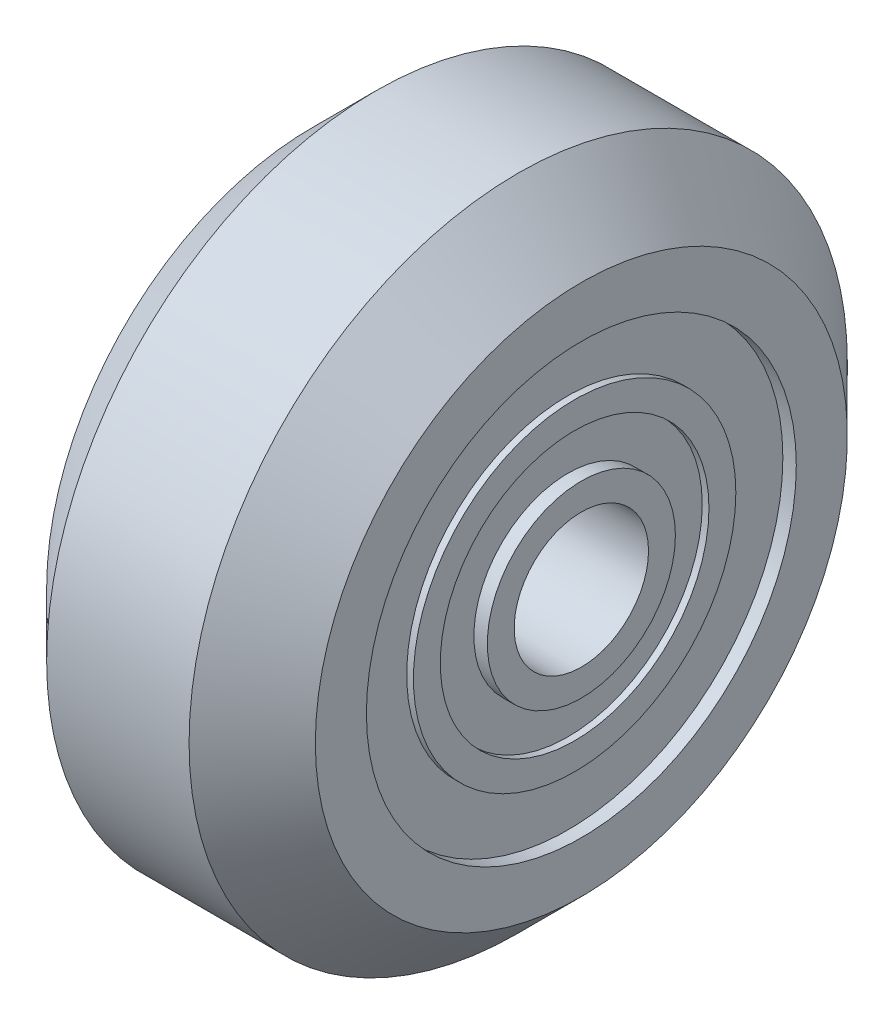
ISO-10303-21;
HEADER;
FILE_DESCRIPTION(('STEP AP214'),'2;1');
FILE_NAME('part.step','',(''),(''),'','','');
FILE_SCHEMA(('AUTOMOTIVE_DESIGN { 1 0 10303 214 1 1 1 1 }'));
ENDSEC;
DATA;
#1=APPLICATION_CONTEXT('core data for automotive mechanical design processes');
#2=APPLICATION_PROTOCOL_DEFINITION('international standard','automotive_design',2000,#1);
#3=PRODUCT_CONTEXT('',#1,'mechanical');
#4=PRODUCT('Part','Part','',(#3));
#5=PRODUCT_RELATED_PRODUCT_CATEGORY('part','',(#4));
#6=PRODUCT_DEFINITION_FORMATION('','',#4);
#7=PRODUCT_DEFINITION_CONTEXT('part definition',#1,'design');
#8=PRODUCT_DEFINITION('design','',#6,#7);
#9=PRODUCT_DEFINITION_SHAPE('','',#8);
#10=(LENGTH_UNIT() NAMED_UNIT(*) SI_UNIT(.MILLI.,.METRE.));
#11=(NAMED_UNIT(*) PLANE_ANGLE_UNIT() SI_UNIT($,.RADIAN.));
#12=(NAMED_UNIT(*) SI_UNIT($,.STERADIAN.) SOLID_ANGLE_UNIT());
#13=UNCERTAINTY_MEASURE_WITH_UNIT(LENGTH_MEASURE(1.E-05),#10,'distance_accuracy_value','');
#14=(GEOMETRIC_REPRESENTATION_CONTEXT(3) GLOBAL_UNCERTAINTY_ASSIGNED_CONTEXT((#13)) GLOBAL_UNIT_ASSIGNED_CONTEXT((#10,
#11,#12)) REPRESENTATION_CONTEXT('',''));
#15=CARTESIAN_POINT('',(0.,0.,0.));
#16=DIRECTION('',(0.,0.,1.));
#17=DIRECTION('',(1.,0.,0.));
#18=AXIS2_PLACEMENT_3D('',#15,#16,#17);
#19=CARTESIAN_POINT('',(4.75,0.,0.));
#20=DIRECTION('',(-1.,0.,0.));
#21=DIRECTION('',(0.,0.,1.));
#22=AXIS2_PLACEMENT_3D('',#19,#20,#21);
#23=CYLINDRICAL_SURFACE('',#22,5.);
#24=CARTESIAN_POINT('',(-4.75,0.,0.));
#25=DIRECTION('',(1.,0.,0.));
#26=DIRECTION('',(0.,0.,-1.));
#27=AXIS2_PLACEMENT_3D('',#24,#25,#26);
#28=CIRCLE('',#27,5.);
#29=CARTESIAN_POINT('',(-4.75,0.,-5.));
#30=VERTEX_POINT('',#29);
#31=EDGE_CURVE('E101',#30,#30,#28,.T.);
#32=ORIENTED_EDGE('',*,*,#31,.F.);
#33=EDGE_LOOP('',(#32));
#34=FACE_BOUND('',#33,.T.);
#35=CARTESIAN_POINT('',(-4.5,0.,0.));
#36=DIRECTION('',(1.,0.,0.));
#37=DIRECTION('',(0.,0.,-1.));
#38=AXIS2_PLACEMENT_3D('',#35,#36,#37);
#39=CIRCLE('',#38,5.);
#40=CARTESIAN_POINT('',(-4.5,0.,-5.));
#41=VERTEX_POINT('',#40);
#42=EDGE_CURVE('E112',#41,#41,#39,.T.);
#43=ORIENTED_EDGE('',*,*,#42,.T.);
#44=EDGE_LOOP('',(#43));
#45=FACE_BOUND('',#44,.T.);
#46=ADVANCED_FACE('F43',(#34,#45),#23,.F.);
#47=CARTESIAN_POINT('',(-45.5860465116277,0.,0.));
#48=DIRECTION('',(-1.,0.,0.));
#49=DIRECTION('',(0.,0.,1.));
#50=AXIS2_PLACEMENT_3D('',#47,#48,#49);
#51=CYLINDRICAL_SURFACE('',#50,8.);
#52=CARTESIAN_POINT('',(-5.,0.,0.));
#53=DIRECTION('',(-1.,0.,0.));
#54=DIRECTION('',(0.,0.,1.));
#55=AXIS2_PLACEMENT_3D('',#52,#53,#54);
#56=CIRCLE('',#55,8.);
#57=CARTESIAN_POINT('',(-5.,0.,8.));
#58=VERTEX_POINT('',#57);
#59=EDGE_CURVE('E79',#58,#58,#56,.T.);
#60=ORIENTED_EDGE('',*,*,#59,.T.);
#61=EDGE_LOOP('',(#60));
#62=FACE_BOUND('',#61,.T.);
#63=CARTESIAN_POINT('',(-4.5,0.,0.));
#64=DIRECTION('',(1.,0.,0.));
#65=DIRECTION('',(0.,0.,-1.));
#66=AXIS2_PLACEMENT_3D('',#63,#64,#65);
#67=CIRCLE('',#66,8.);
#68=CARTESIAN_POINT('',(-4.5,0.,-8.));
#69=VERTEX_POINT('',#68);
#70=EDGE_CURVE('E51',#69,#69,#67,.F.);
#71=ORIENTED_EDGE('',*,*,#70,.F.);
#72=EDGE_LOOP('',(#71));
#73=FACE_BOUND('',#72,.T.);
#74=ADVANCED_FACE('F164',(#62,#73),#51,.F.);
#75=CARTESIAN_POINT('',(4.5,0.,0.));
#76=DIRECTION('',(1.,0.,0.));
#77=DIRECTION('',(0.,0.,-1.));
#78=AXIS2_PLACEMENT_3D('',#75,#76,#77);
#79=CIRCLE('',#78,8.);
#80=CARTESIAN_POINT('',(4.5,0.,-8.));
#81=VERTEX_POINT('',#80);
#82=EDGE_CURVE('E83',#81,#81,#79,.T.);
#83=ORIENTED_EDGE('',*,*,#82,.F.);
#84=EDGE_LOOP('',(#83));
#85=FACE_BOUND('',#84,.T.);
#86=CARTESIAN_POINT('',(5.,0.,0.));
#87=DIRECTION('',(-1.,0.,0.));
#88=DIRECTION('',(0.,0.,1.));
#89=AXIS2_PLACEMENT_3D('',#86,#87,#88);
#90=CIRCLE('',#89,8.);
#91=CARTESIAN_POINT('',(5.,0.,8.));
#92=VERTEX_POINT('',#91);
#93=EDGE_CURVE('E56',#92,#92,#90,.T.);
#94=ORIENTED_EDGE('',*,*,#93,.F.);
#95=EDGE_LOOP('',(#94));
#96=FACE_BOUND('',#95,.T.);
#97=ADVANCED_FACE('F45',(#85,#96),#51,.F.);
#98=CARTESIAN_POINT('',(5.,8.,0.));
#99=DIRECTION('',(-1.,0.,0.));
#100=DIRECTION('',(0.,0.,1.));
#101=AXIS2_PLACEMENT_3D('',#98,#99,#100);
#102=PLANE('',#101);
#103=CARTESIAN_POINT('',(5.,0.,0.));
#104=DIRECTION('',(-1.,0.,0.));
#105=DIRECTION('',(0.,0.,1.));
#106=AXIS2_PLACEMENT_3D('',#103,#104,#105);
#107=CIRCLE('',#106,9.9);
#108=CARTESIAN_POINT('',(5.,0.,9.9));
#109=VERTEX_POINT('',#108);
#110=EDGE_CURVE('E61',#109,#109,#107,.T.);
#111=ORIENTED_EDGE('',*,*,#110,.F.);
#112=EDGE_LOOP('',(#111));
#113=FACE_BOUND('',#112,.T.);
#114=ORIENTED_EDGE('',*,*,#93,.T.);
#115=EDGE_LOOP('',(#114));
#116=FACE_BOUND('',#115,.T.);
#117=ADVANCED_FACE('F354',(#113,#116),#102,.F.);
#118=CARTESIAN_POINT('',(5.,0.,0.));
#119=DIRECTION('',(-1.,0.,0.));
#120=DIRECTION('',(0.,0.,1.));
#121=AXIS2_PLACEMENT_3D('',#118,#119,#120);
#122=CONICAL_SURFACE('',#121,9.9,0.785398163397447);
#123=CARTESIAN_POINT('',(2.65,0.,0.));
#124=DIRECTION('',(-1.,0.,0.));
#125=DIRECTION('',(0.,0.,1.));
#126=AXIS2_PLACEMENT_3D('',#123,#124,#125);
#127=CIRCLE('',#126,12.25);
#128=CARTESIAN_POINT('',(2.65,0.,12.25));
#129=VERTEX_POINT('',#128);
#130=EDGE_CURVE('E67',#129,#129,#127,.T.);
#131=ORIENTED_EDGE('',*,*,#130,.F.);
#132=EDGE_LOOP('',(#131));
#133=FACE_BOUND('',#132,.T.);
#134=ORIENTED_EDGE('',*,*,#110,.T.);
#135=EDGE_LOOP('',(#134));
#136=FACE_BOUND('',#135,.T.);
#137=ADVANCED_FACE('F345',(#133,#136),#122,.T.);
#138=CARTESIAN_POINT('',(-45.5860465116277,0.,0.));
#139=DIRECTION('',(-1.,0.,0.));
#140=DIRECTION('',(0.,0.,1.));
#141=AXIS2_PLACEMENT_3D('',#138,#139,#140);
#142=CYLINDRICAL_SURFACE('',#141,12.25);
#143=CARTESIAN_POINT('',(-2.64999999999999,0.,0.));
#144=DIRECTION('',(-1.,0.,0.));
#145=DIRECTION('',(0.,0.,1.));
#146=AXIS2_PLACEMENT_3D('',#143,#144,#145);
#147=CIRCLE('',#146,12.25);
#148=CARTESIAN_POINT('',(-2.64999999999999,0.,12.25));
#149=VERTEX_POINT('',#148);
#150=EDGE_CURVE('E71',#149,#149,#147,.T.);
#151=ORIENTED_EDGE('',*,*,#150,.F.);
#152=EDGE_LOOP('',(#151));
#153=FACE_BOUND('',#152,.T.);
#154=ORIENTED_EDGE('',*,*,#130,.T.);
#155=EDGE_LOOP('',(#154));
#156=FACE_BOUND('',#155,.T.);
#157=ADVANCED_FACE('F336',(#153,#156),#142,.T.);
#158=CARTESIAN_POINT('',(-2.64999999999999,0.,0.));
#159=DIRECTION('',(1.,0.,0.));
#160=DIRECTION('',(0.,0.,-1.));
#161=AXIS2_PLACEMENT_3D('',#158,#159,#160);
#162=CONICAL_SURFACE('',#161,12.25,0.785398163397449);
#163=CARTESIAN_POINT('',(-4.99999999999999,0.,0.));
#164=DIRECTION('',(-1.,0.,0.));
#165=DIRECTION('',(0.,0.,1.));
#166=AXIS2_PLACEMENT_3D('',#163,#164,#165);
#167=CIRCLE('',#166,9.9);
#168=CARTESIAN_POINT('',(-4.99999999999999,0.,9.9));
#169=VERTEX_POINT('',#168);
#170=EDGE_CURVE('E75',#169,#169,#167,.T.);
#171=ORIENTED_EDGE('',*,*,#170,.F.);
#172=EDGE_LOOP('',(#171));
#173=FACE_BOUND('',#172,.T.);
#174=ORIENTED_EDGE('',*,*,#150,.T.);
#175=EDGE_LOOP('',(#174));
#176=FACE_BOUND('',#175,.T.);
#177=ADVANCED_FACE('F327',(#173,#176),#162,.T.);
#178=CARTESIAN_POINT('',(-4.99999999999999,8.,0.));
#179=DIRECTION('',(1.,0.,0.));
#180=DIRECTION('',(0.,0.,-1.));
#181=AXIS2_PLACEMENT_3D('',#178,#179,#180);
#182=PLANE('',#181);
#183=ORIENTED_EDGE('',*,*,#59,.F.);
#184=EDGE_LOOP('',(#183));
#185=FACE_BOUND('',#184,.T.);
#186=ORIENTED_EDGE('',*,*,#170,.T.);
#187=EDGE_LOOP('',(#186));
#188=FACE_BOUND('',#187,.T.);
#189=ADVANCED_FACE('F312',(#185,#188),#182,.F.);
#190=CARTESIAN_POINT('',(4.5,0.,0.));
#191=DIRECTION('',(1.,0.,0.));
#192=DIRECTION('',(0.,0.,-1.));
#193=AXIS2_PLACEMENT_3D('',#190,#191,#192);
#194=PLANE('',#193);
#195=CARTESIAN_POINT('',(4.5,0.,0.));
#196=DIRECTION('',(1.,0.,0.));
#197=DIRECTION('',(0.,0.,-1.));
#198=AXIS2_PLACEMENT_3D('',#195,#196,#197);
#199=CIRCLE('',#198,6.);
#200=CARTESIAN_POINT('',(4.5,0.,-6.));
#201=VERTEX_POINT('',#200);
#202=EDGE_CURVE('E87',#201,#201,#199,.T.);
#203=ORIENTED_EDGE('',*,*,#202,.F.);
#204=EDGE_LOOP('',(#203));
#205=FACE_BOUND('',#204,.T.);
#206=ORIENTED_EDGE('',*,*,#82,.T.);
#207=EDGE_LOOP('',(#206));
#208=FACE_BOUND('',#207,.T.);
#209=ADVANCED_FACE('F302',(#205,#208),#194,.T.);
#210=CARTESIAN_POINT('',(-4.5,0.,0.));
#211=DIRECTION('',(1.,0.,0.));
#212=DIRECTION('',(0.,0.,-1.));
#213=AXIS2_PLACEMENT_3D('',#210,#211,#212);
#214=PLANE('',#213);
#215=CARTESIAN_POINT('',(-4.5,0.,0.));
#216=DIRECTION('',(1.,0.,0.));
#217=DIRECTION('',(0.,0.,-1.));
#218=AXIS2_PLACEMENT_3D('',#215,#216,#217);
#219=CIRCLE('',#218,6.);
#220=CARTESIAN_POINT('',(-4.5,0.,-6.));
#221=VERTEX_POINT('',#220);
#222=EDGE_CURVE('E91',#221,#221,#219,.F.);
#223=ORIENTED_EDGE('',*,*,#222,.F.);
#224=EDGE_LOOP('',(#223));
#225=FACE_BOUND('',#224,.T.);
#226=ORIENTED_EDGE('',*,*,#70,.T.);
#227=EDGE_LOOP('',(#226));
#228=FACE_BOUND('',#227,.T.);
#229=ADVANCED_FACE('F186',(#225,#228),#214,.F.);
#230=CARTESIAN_POINT('',(4.75,0.,0.));
#231=DIRECTION('',(-1.,0.,0.));
#232=DIRECTION('',(0.,0.,1.));
#233=AXIS2_PLACEMENT_3D('',#230,#231,#232);
#234=CYLINDRICAL_SURFACE('',#233,6.);
#235=CARTESIAN_POINT('',(-4.75,0.,0.));
#236=DIRECTION('',(1.,0.,0.));
#237=DIRECTION('',(0.,0.,-1.));
#238=AXIS2_PLACEMENT_3D('',#235,#236,#237);
#239=CIRCLE('',#238,6.);
#240=CARTESIAN_POINT('',(-4.75,0.,-6.));
#241=VERTEX_POINT('',#240);
#242=EDGE_CURVE('E96',#241,#241,#239,.T.);
#243=ORIENTED_EDGE('',*,*,#242,.T.);
#244=EDGE_LOOP('',(#243));
#245=FACE_BOUND('',#244,.T.);
#246=ORIENTED_EDGE('',*,*,#222,.T.);
#247=EDGE_LOOP('',(#246));
#248=FACE_BOUND('',#247,.T.);
#249=ADVANCED_FACE('F178',(#245,#248),#234,.T.);
#250=CARTESIAN_POINT('',(4.5,0.,0.));
#251=DIRECTION('',(1.,0.,0.));
#252=DIRECTION('',(0.,0.,-1.));
#253=AXIS2_PLACEMENT_3D('',#250,#251,#252);
#254=CIRCLE('',#253,5.);
#255=CARTESIAN_POINT('',(4.5,0.,-5.));
#256=VERTEX_POINT('',#255);
#257=EDGE_CURVE('E10',#256,#256,#254,.T.);
#258=ORIENTED_EDGE('',*,*,#257,.F.);
#259=EDGE_LOOP('',(#258));
#260=FACE_BOUND('',#259,.T.);
#261=CARTESIAN_POINT('',(4.75,0.,0.));
#262=DIRECTION('',(1.,0.,0.));
#263=DIRECTION('',(0.,0.,-1.));
#264=AXIS2_PLACEMENT_3D('',#261,#262,#263);
#265=CIRCLE('',#264,5.);
#266=CARTESIAN_POINT('',(4.75,0.,-5.));
#267=VERTEX_POINT('',#266);
#268=EDGE_CURVE('E100',#267,#267,#265,.T.);
#269=ORIENTED_EDGE('',*,*,#268,.T.);
#270=EDGE_LOOP('',(#269));
#271=FACE_BOUND('',#270,.T.);
#272=ADVANCED_FACE('F167',(#260,#271),#23,.F.);
#273=ORIENTED_EDGE('',*,*,#202,.T.);
#274=EDGE_LOOP('',(#273));
#275=FACE_BOUND('',#274,.T.);
#276=CARTESIAN_POINT('',(4.75,0.,0.));
#277=DIRECTION('',(1.,0.,0.));
#278=DIRECTION('',(0.,0.,-1.));
#279=AXIS2_PLACEMENT_3D('',#276,#277,#278);
#280=CIRCLE('',#279,6.);
#281=CARTESIAN_POINT('',(4.75,0.,-6.));
#282=VERTEX_POINT('',#281);
#283=EDGE_CURVE('E95',#282,#282,#280,.T.);
#284=ORIENTED_EDGE('',*,*,#283,.F.);
#285=EDGE_LOOP('',(#284));
#286=FACE_BOUND('',#285,.T.);
#287=ADVANCED_FACE('F177',(#275,#286),#234,.T.);
#288=CARTESIAN_POINT('',(4.75,0.,0.));
#289=DIRECTION('',(1.,0.,0.));
#290=DIRECTION('',(0.,0.,-1.));
#291=AXIS2_PLACEMENT_3D('',#288,#289,#290);
#292=PLANE('',#291);
#293=ORIENTED_EDGE('',*,*,#268,.F.);
#294=EDGE_LOOP('',(#293));
#295=FACE_BOUND('',#294,.T.);
#296=ORIENTED_EDGE('',*,*,#283,.T.);
#297=EDGE_LOOP('',(#296));
#298=FACE_BOUND('',#297,.T.);
#299=ADVANCED_FACE('F184',(#295,#298),#292,.T.);
#300=CARTESIAN_POINT('',(-4.75,0.,0.));
#301=DIRECTION('',(1.,0.,0.));
#302=DIRECTION('',(0.,0.,-1.));
#303=AXIS2_PLACEMENT_3D('',#300,#301,#302);
#304=PLANE('',#303);
#305=ORIENTED_EDGE('',*,*,#31,.T.);
#306=EDGE_LOOP('',(#305));
#307=FACE_BOUND('',#306,.T.);
#308=ORIENTED_EDGE('',*,*,#242,.F.);
#309=EDGE_LOOP('',(#308));
#310=FACE_BOUND('',#309,.T.);
#311=ADVANCED_FACE('F193',(#307,#310),#304,.F.);
#312=CARTESIAN_POINT('',(4.5,0.,0.));
#313=DIRECTION('',(1.,0.,0.));
#314=DIRECTION('',(0.,0.,-1.));
#315=AXIS2_PLACEMENT_3D('',#312,#313,#314);
#316=PLANE('',#315);
#317=CARTESIAN_POINT('',(4.5,0.,0.));
#318=DIRECTION('',(1.,0.,0.));
#319=DIRECTION('',(0.,0.,-1.));
#320=AXIS2_PLACEMENT_3D('',#317,#318,#319);
#321=CIRCLE('',#320,3.5);
#322=CARTESIAN_POINT('',(4.5,0.,-3.5));
#323=VERTEX_POINT('',#322);
#324=EDGE_CURVE('E105',#323,#323,#321,.T.);
#325=ORIENTED_EDGE('',*,*,#324,.F.);
#326=EDGE_LOOP('',(#325));
#327=FACE_BOUND('',#326,.T.);
#328=ORIENTED_EDGE('',*,*,#257,.T.);
#329=EDGE_LOOP('',(#328));
#330=FACE_BOUND('',#329,.T.);
#331=ADVANCED_FACE('F200',(#327,#330),#316,.T.);
#332=CARTESIAN_POINT('',(-4.5,0.,0.));
#333=DIRECTION('',(1.,0.,0.));
#334=DIRECTION('',(0.,0.,-1.));
#335=AXIS2_PLACEMENT_3D('',#332,#333,#334);
#336=PLANE('',#335);
#337=CARTESIAN_POINT('',(-4.5,0.,0.));
#338=DIRECTION('',(1.,0.,0.));
#339=DIRECTION('',(0.,0.,-1.));
#340=AXIS2_PLACEMENT_3D('',#337,#338,#339);
#341=CIRCLE('',#340,3.5);
#342=CARTESIAN_POINT('',(-4.5,0.,-3.5));
#343=VERTEX_POINT('',#342);
#344=EDGE_CURVE('E116',#343,#343,#341,.F.);
#345=ORIENTED_EDGE('',*,*,#344,.F.);
#346=EDGE_LOOP('',(#345));
#347=FACE_BOUND('',#346,.T.);
#348=ORIENTED_EDGE('',*,*,#42,.F.);
#349=EDGE_LOOP('',(#348));
#350=FACE_BOUND('',#349,.T.);
#351=ADVANCED_FACE('F161',(#347,#350),#336,.F.);
#352=CARTESIAN_POINT('',(5.,0.,0.));
#353=DIRECTION('',(-1.,0.,0.));
#354=DIRECTION('',(0.,0.,1.));
#355=AXIS2_PLACEMENT_3D('',#352,#353,#354);
#356=CYLINDRICAL_SURFACE('',#355,3.5);
#357=CARTESIAN_POINT('',(-5.,0.,0.));
#358=DIRECTION('',(1.,0.,0.));
#359=DIRECTION('',(0.,0.,-1.));
#360=AXIS2_PLACEMENT_3D('',#357,#358,#359);
#361=CIRCLE('',#360,3.5);
#362=CARTESIAN_POINT('',(-5.,0.,-3.5));
#363=VERTEX_POINT('',#362);
#364=EDGE_CURVE('E124',#363,#363,#361,.T.);
#365=ORIENTED_EDGE('',*,*,#364,.T.);
#366=EDGE_LOOP('',(#365));
#367=FACE_BOUND('',#366,.T.);
#368=ORIENTED_EDGE('',*,*,#344,.T.);
#369=EDGE_LOOP('',(#368));
#370=FACE_BOUND('',#369,.T.);
#371=ADVANCED_FACE('F154',(#367,#370),#356,.T.);
#372=CARTESIAN_POINT('',(5.,0.,0.));
#373=DIRECTION('',(-1.,0.,0.));
#374=DIRECTION('',(0.,0.,1.));
#375=AXIS2_PLACEMENT_3D('',#372,#373,#374);
#376=CYLINDRICAL_SURFACE('',#375,2.5);
#377=CARTESIAN_POINT('',(5.,0.,0.));
#378=DIRECTION('',(1.,0.,0.));
#379=DIRECTION('',(0.,0.,-1.));
#380=AXIS2_PLACEMENT_3D('',#377,#378,#379);
#381=CIRCLE('',#380,2.5);
#382=CARTESIAN_POINT('',(5.,0.,-2.5));
#383=VERTEX_POINT('',#382);
#384=EDGE_CURVE('E128',#383,#383,#381,.T.);
#385=ORIENTED_EDGE('',*,*,#384,.T.);
#386=EDGE_LOOP('',(#385));
#387=FACE_BOUND('',#386,.T.);
#388=CARTESIAN_POINT('',(-5.,0.,0.));
#389=DIRECTION('',(1.,0.,0.));
#390=DIRECTION('',(0.,0.,-1.));
#391=AXIS2_PLACEMENT_3D('',#388,#389,#390);
#392=CIRCLE('',#391,2.5);
#393=CARTESIAN_POINT('',(-5.,0.,-2.5));
#394=VERTEX_POINT('',#393);
#395=EDGE_CURVE('E129',#394,#394,#392,.T.);
#396=ORIENTED_EDGE('',*,*,#395,.F.);
#397=EDGE_LOOP('',(#396));
#398=FACE_BOUND('',#397,.T.);
#399=ADVANCED_FACE('F140',(#387,#398),#376,.F.);
#400=ORIENTED_EDGE('',*,*,#324,.T.);
#401=EDGE_LOOP('',(#400));
#402=FACE_BOUND('',#401,.T.);
#403=CARTESIAN_POINT('',(5.,0.,0.));
#404=DIRECTION('',(1.,0.,0.));
#405=DIRECTION('',(0.,0.,-1.));
#406=AXIS2_PLACEMENT_3D('',#403,#404,#405);
#407=CIRCLE('',#406,3.5);
#408=CARTESIAN_POINT('',(5.,0.,-3.5));
#409=VERTEX_POINT('',#408);
#410=EDGE_CURVE('E123',#409,#409,#407,.T.);
#411=ORIENTED_EDGE('',*,*,#410,.F.);
#412=EDGE_LOOP('',(#411));
#413=FACE_BOUND('',#412,.T.);
#414=ADVANCED_FACE('F147',(#402,#413),#356,.T.);
#415=CARTESIAN_POINT('',(5.,0.,0.));
#416=DIRECTION('',(1.,0.,0.));
#417=DIRECTION('',(0.,0.,-1.));
#418=AXIS2_PLACEMENT_3D('',#415,#416,#417);
#419=PLANE('',#418);
#420=ORIENTED_EDGE('',*,*,#384,.F.);
#421=EDGE_LOOP('',(#420));
#422=FACE_BOUND('',#421,.T.);
#423=ORIENTED_EDGE('',*,*,#410,.T.);
#424=EDGE_LOOP('',(#423));
#425=FACE_BOUND('',#424,.T.);
#426=ADVANCED_FACE('F143',(#422,#425),#419,.T.);
#427=CARTESIAN_POINT('',(-5.,0.,0.));
#428=DIRECTION('',(1.,0.,0.));
#429=DIRECTION('',(0.,0.,-1.));
#430=AXIS2_PLACEMENT_3D('',#427,#428,#429);
#431=PLANE('',#430);
#432=ORIENTED_EDGE('',*,*,#395,.T.);
#433=EDGE_LOOP('',(#432));
#434=FACE_BOUND('',#433,.T.);
#435=ORIENTED_EDGE('',*,*,#364,.F.);
#436=EDGE_LOOP('',(#435));
#437=FACE_BOUND('',#436,.T.);
#438=ADVANCED_FACE('F146',(#434,#437),#431,.F.);
#439=CLOSED_SHELL('',(#46,#74,#97,#117,#137,#157,#177,#189,#209,#229,#249,#272,#287,#299,#311,
#331,#351,#371,#399,#414,#426,#438));
#440=MANIFOLD_SOLID_BREP('B2',#439);
#441=ADVANCED_BREP_SHAPE_REPRESENTATION('',(#18,#440),#14);
#442=SHAPE_DEFINITION_REPRESENTATION(#9,#441);
ENDSEC;
END-ISO-10303-21;
